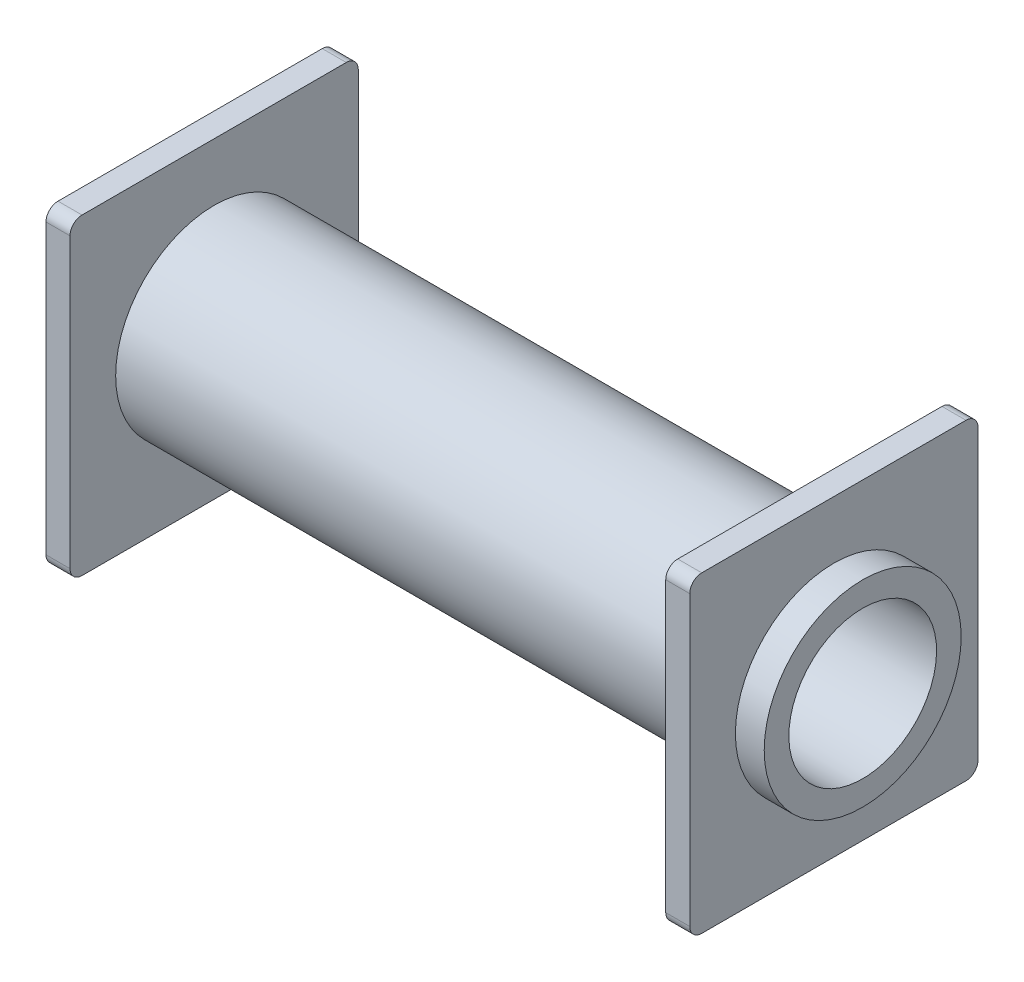
ISO-10303-21;
HEADER;
FILE_DESCRIPTION(('STEP AP214'),'2;1');
FILE_NAME('part.step','',(''),(''),'','','');
FILE_SCHEMA(('AUTOMOTIVE_DESIGN { 1 0 10303 214 1 1 1 1 }'));
ENDSEC;
DATA;
#1=APPLICATION_CONTEXT('core data for automotive mechanical design processes');
#2=APPLICATION_PROTOCOL_DEFINITION('international standard','automotive_design',2000,#1);
#3=PRODUCT_CONTEXT('',#1,'mechanical');
#4=PRODUCT('Part','Part','',(#3));
#5=PRODUCT_RELATED_PRODUCT_CATEGORY('part','',(#4));
#6=PRODUCT_DEFINITION_FORMATION('','',#4);
#7=PRODUCT_DEFINITION_CONTEXT('part definition',#1,'design');
#8=PRODUCT_DEFINITION('design','',#6,#7);
#9=PRODUCT_DEFINITION_SHAPE('','',#8);
#10=(LENGTH_UNIT() NAMED_UNIT(*) SI_UNIT(.MILLI.,.METRE.));
#11=(NAMED_UNIT(*) PLANE_ANGLE_UNIT() SI_UNIT($,.RADIAN.));
#12=(NAMED_UNIT(*) SI_UNIT($,.STERADIAN.) SOLID_ANGLE_UNIT());
#13=UNCERTAINTY_MEASURE_WITH_UNIT(LENGTH_MEASURE(1.E-05),#10,'distance_accuracy_value','');
#14=(GEOMETRIC_REPRESENTATION_CONTEXT(3) GLOBAL_UNCERTAINTY_ASSIGNED_CONTEXT((#13)) GLOBAL_UNIT_ASSIGNED_CONTEXT((#10,
#11,#12)) REPRESENTATION_CONTEXT('',''));
#15=CARTESIAN_POINT('',(0.,0.,0.));
#16=DIRECTION('',(0.,0.,1.));
#17=DIRECTION('',(1.,0.,0.));
#18=AXIS2_PLACEMENT_3D('',#15,#16,#17);
#19=CARTESIAN_POINT('',(-14.,0.,0.));
#20=DIRECTION('',(-1.,0.,0.));
#21=DIRECTION('',(0.,-1.,0.));
#22=AXIS2_PLACEMENT_3D('',#19,#20,#21);
#23=CYLINDRICAL_SURFACE('',#22,4.1);
#24=CARTESIAN_POINT('',(12.8,0.,0.));
#25=DIRECTION('',(1.,0.,0.));
#26=DIRECTION('',(0.,1.,0.));
#27=AXIS2_PLACEMENT_3D('',#24,#25,#26);
#28=CIRCLE('',#27,4.1);
#29=CARTESIAN_POINT('',(12.8,4.1,0.));
#30=VERTEX_POINT('',#29);
#31=EDGE_CURVE('E318',#30,#30,#28,.T.);
#32=ORIENTED_EDGE('',*,*,#31,.T.);
#33=EDGE_LOOP('',(#32));
#34=FACE_BOUND('',#33,.T.);
#35=CARTESIAN_POINT('',(14.,0.,0.));
#36=DIRECTION('',(-1.,0.,0.));
#37=DIRECTION('',(0.,-1.,0.));
#38=AXIS2_PLACEMENT_3D('',#35,#36,#37);
#39=CIRCLE('',#38,4.1);
#40=CARTESIAN_POINT('',(14.,-4.09999999999999,0.));
#41=VERTEX_POINT('',#40);
#42=EDGE_CURVE('E190',#41,#41,#39,.T.);
#43=ORIENTED_EDGE('',*,*,#42,.T.);
#44=EDGE_LOOP('',(#43));
#45=FACE_BOUND('',#44,.T.);
#46=ADVANCED_FACE('F38',(#34,#45),#23,.T.);
#47=CARTESIAN_POINT('',(14.,0.,0.));
#48=DIRECTION('',(-1.,0.,0.));
#49=DIRECTION('',(0.,-1.,0.));
#50=AXIS2_PLACEMENT_3D('',#47,#48,#49);
#51=PLANE('',#50);
#52=CARTESIAN_POINT('',(14.,0.,0.));
#53=DIRECTION('',(1.,0.,0.));
#54=DIRECTION('',(0.,1.,0.));
#55=AXIS2_PLACEMENT_3D('',#52,#53,#54);
#56=CIRCLE('',#55,3.075);
#57=CARTESIAN_POINT('',(14.,3.07500000000001,0.));
#58=VERTEX_POINT('',#57);
#59=EDGE_CURVE('E442',#58,#58,#56,.T.);
#60=ORIENTED_EDGE('',*,*,#59,.F.);
#61=EDGE_LOOP('',(#60));
#62=FACE_BOUND('',#61,.T.);
#63=ORIENTED_EDGE('',*,*,#42,.F.);
#64=EDGE_LOOP('',(#63));
#65=FACE_BOUND('',#64,.T.);
#66=ADVANCED_FACE('F383',(#62,#65),#51,.F.);
#67=CARTESIAN_POINT('',(12.8,6.5,6.));
#68=DIRECTION('',(0.,0.,-1.));
#69=DIRECTION('',(0.,1.,0.));
#70=AXIS2_PLACEMENT_3D('',#67,#68,#69);
#71=PLANE('',#70);
#72=DIRECTION('',(0.,-1.,0.));
#73=VECTOR('',#72,1.);
#74=CARTESIAN_POINT('',(11.8,6.5,6.));
#75=LINE('',#74,#73);
#76=CARTESIAN_POINT('',(11.8,6.,6.));
#77=VERTEX_POINT('',#76);
#78=CARTESIAN_POINT('',(11.8,-5.99999999999999,6.));
#79=VERTEX_POINT('',#78);
#80=EDGE_CURVE('E287',#77,#79,#75,.T.);
#81=ORIENTED_EDGE('',*,*,#80,.T.);
#82=DIRECTION('',(-1.,0.,0.));
#83=VECTOR('',#82,1.);
#84=CARTESIAN_POINT('',(12.8,-6.,6.));
#85=LINE('',#84,#83);
#86=CARTESIAN_POINT('',(12.8,-5.99999999999999,6.));
#87=VERTEX_POINT('',#86);
#88=EDGE_CURVE('E275',#79,#87,#85,.F.);
#89=ORIENTED_EDGE('',*,*,#88,.T.);
#90=DIRECTION('',(0.,-1.,0.));
#91=VECTOR('',#90,1.);
#92=CARTESIAN_POINT('',(12.8,6.5,6.));
#93=LINE('',#92,#91);
#94=CARTESIAN_POINT('',(12.8,6.,6.));
#95=VERTEX_POINT('',#94);
#96=EDGE_CURVE('E303',#95,#87,#93,.T.);
#97=ORIENTED_EDGE('',*,*,#96,.F.);
#98=DIRECTION('',(-1.,0.,0.));
#99=VECTOR('',#98,1.);
#100=CARTESIAN_POINT('',(12.8,6.,6.));
#101=LINE('',#100,#99);
#102=EDGE_CURVE('E271',#95,#77,#101,.T.);
#103=ORIENTED_EDGE('',*,*,#102,.T.);
#104=EDGE_LOOP('',(#81,#89,#97,#103));
#105=FACE_BOUND('',#104,.T.);
#106=ADVANCED_FACE('F371',(#105),#71,.F.);
#107=CARTESIAN_POINT('',(12.8,-6.5,6.));
#108=DIRECTION('',(0.,1.,0.));
#109=DIRECTION('',(-1.,0.,0.));
#110=AXIS2_PLACEMENT_3D('',#107,#108,#109);
#111=PLANE('',#110);
#112=DIRECTION('',(0.,0.,-1.));
#113=VECTOR('',#112,1.);
#114=CARTESIAN_POINT('',(11.8,-6.5,6.));
#115=LINE('',#114,#113);
#116=CARTESIAN_POINT('',(11.8,-6.5,5.5));
#117=VERTEX_POINT('',#116);
#118=CARTESIAN_POINT('',(11.8,-6.5,-5.5));
#119=VERTEX_POINT('',#118);
#120=EDGE_CURVE('E322',#117,#119,#115,.T.);
#121=ORIENTED_EDGE('',*,*,#120,.T.);
#122=DIRECTION('',(-1.,0.,0.));
#123=VECTOR('',#122,1.);
#124=CARTESIAN_POINT('',(12.8,-6.5,-5.5));
#125=LINE('',#124,#123);
#126=CARTESIAN_POINT('',(12.8,-6.5,-5.5));
#127=VERTEX_POINT('',#126);
#128=EDGE_CURVE('E257',#119,#127,#125,.F.);
#129=ORIENTED_EDGE('',*,*,#128,.T.);
#130=DIRECTION('',(0.,0.,-1.));
#131=VECTOR('',#130,1.);
#132=CARTESIAN_POINT('',(12.8,-6.5,6.));
#133=LINE('',#132,#131);
#134=CARTESIAN_POINT('',(12.8,-6.5,5.5));
#135=VERTEX_POINT('',#134);
#136=EDGE_CURVE('E307',#135,#127,#133,.T.);
#137=ORIENTED_EDGE('',*,*,#136,.F.);
#138=DIRECTION('',(-1.,0.,0.));
#139=VECTOR('',#138,1.);
#140=CARTESIAN_POINT('',(12.8,-6.5,5.5));
#141=LINE('',#140,#139);
#142=EDGE_CURVE('E253',#135,#117,#141,.T.);
#143=ORIENTED_EDGE('',*,*,#142,.T.);
#144=EDGE_LOOP('',(#121,#129,#137,#143));
#145=FACE_BOUND('',#144,.T.);
#146=ADVANCED_FACE('F375',(#145),#111,.F.);
#147=CARTESIAN_POINT('',(12.8,6.5,-6.));
#148=DIRECTION('',(0.,0.,1.));
#149=DIRECTION('',(0.,-1.,0.));
#150=AXIS2_PLACEMENT_3D('',#147,#148,#149);
#151=PLANE('',#150);
#152=DIRECTION('',(0.,1.,0.));
#153=VECTOR('',#152,1.);
#154=CARTESIAN_POINT('',(12.8,6.5,-6.));
#155=LINE('',#154,#153);
#156=CARTESIAN_POINT('',(12.8,-5.99999999999999,-6.));
#157=VERTEX_POINT('',#156);
#158=CARTESIAN_POINT('',(12.8,6.,-6.));
#159=VERTEX_POINT('',#158);
#160=EDGE_CURVE('E312',#157,#159,#155,.T.);
#161=ORIENTED_EDGE('',*,*,#160,.F.);
#162=DIRECTION('',(-1.,0.,0.));
#163=VECTOR('',#162,1.);
#164=CARTESIAN_POINT('',(12.8,-6.,-6.));
#165=LINE('',#164,#163);
#166=CARTESIAN_POINT('',(11.8,-5.99999999999999,-6.));
#167=VERTEX_POINT('',#166);
#168=EDGE_CURVE('E237',#157,#167,#165,.T.);
#169=ORIENTED_EDGE('',*,*,#168,.T.);
#170=DIRECTION('',(0.,1.,0.));
#171=VECTOR('',#170,1.);
#172=CARTESIAN_POINT('',(11.8,6.5,-6.));
#173=LINE('',#172,#171);
#174=CARTESIAN_POINT('',(11.8,6.,-6.));
#175=VERTEX_POINT('',#174);
#176=EDGE_CURVE('E326',#167,#175,#173,.T.);
#177=ORIENTED_EDGE('',*,*,#176,.T.);
#178=DIRECTION('',(-1.,0.,0.));
#179=VECTOR('',#178,1.);
#180=CARTESIAN_POINT('',(12.8,6.,-6.));
#181=LINE('',#180,#179);
#182=EDGE_CURVE('E234',#175,#159,#181,.F.);
#183=ORIENTED_EDGE('',*,*,#182,.T.);
#184=EDGE_LOOP('',(#161,#169,#177,#183));
#185=FACE_BOUND('',#184,.T.);
#186=ADVANCED_FACE('F357',(#185),#151,.F.);
#187=CARTESIAN_POINT('',(12.8,6.5,6.));
#188=DIRECTION('',(0.,-1.,0.));
#189=DIRECTION('',(1.,0.,0.));
#190=AXIS2_PLACEMENT_3D('',#187,#188,#189);
#191=PLANE('',#190);
#192=DIRECTION('',(0.,0.,1.));
#193=VECTOR('',#192,1.);
#194=CARTESIAN_POINT('',(12.8,6.5,6.));
#195=LINE('',#194,#193);
#196=CARTESIAN_POINT('',(12.8,6.5,-5.5));
#197=VERTEX_POINT('',#196);
#198=CARTESIAN_POINT('',(12.8,6.5,5.5));
#199=VERTEX_POINT('',#198);
#200=EDGE_CURVE('E315',#197,#199,#195,.T.);
#201=ORIENTED_EDGE('',*,*,#200,.F.);
#202=DIRECTION('',(-1.,0.,0.));
#203=VECTOR('',#202,1.);
#204=CARTESIAN_POINT('',(12.8,6.5,-5.5));
#205=LINE('',#204,#203);
#206=CARTESIAN_POINT('',(11.8,6.5,-5.5));
#207=VERTEX_POINT('',#206);
#208=EDGE_CURVE('E11',#197,#207,#205,.T.);
#209=ORIENTED_EDGE('',*,*,#208,.T.);
#210=DIRECTION('',(0.,0.,1.));
#211=VECTOR('',#210,1.);
#212=CARTESIAN_POINT('',(11.8,6.5,6.));
#213=LINE('',#212,#211);
#214=CARTESIAN_POINT('',(11.8,6.5,5.5));
#215=VERTEX_POINT('',#214);
#216=EDGE_CURVE('E308',#207,#215,#213,.T.);
#217=ORIENTED_EDGE('',*,*,#216,.T.);
#218=DIRECTION('',(-1.,0.,0.));
#219=VECTOR('',#218,1.);
#220=CARTESIAN_POINT('',(12.8,6.5,5.5));
#221=LINE('',#220,#219);
#222=EDGE_CURVE('E47',#215,#199,#221,.F.);
#223=ORIENTED_EDGE('',*,*,#222,.T.);
#224=EDGE_LOOP('',(#201,#209,#217,#223));
#225=FACE_BOUND('',#224,.T.);
#226=ADVANCED_FACE('F343',(#225),#191,.F.);
#227=CARTESIAN_POINT('',(12.8,0.,0.));
#228=DIRECTION('',(1.,0.,0.));
#229=DIRECTION('',(0.,1.,0.));
#230=AXIS2_PLACEMENT_3D('',#227,#228,#229);
#231=PLANE('',#230);
#232=ORIENTED_EDGE('',*,*,#31,.F.);
#233=EDGE_LOOP('',(#232));
#234=FACE_BOUND('',#233,.T.);
#235=ORIENTED_EDGE('',*,*,#136,.T.);
#236=CARTESIAN_POINT('',(12.8,-6.,-5.5));
#237=DIRECTION('',(1.,0.,0.));
#238=DIRECTION('',(0.,1.,0.));
#239=AXIS2_PLACEMENT_3D('',#236,#237,#238);
#240=CIRCLE('',#239,0.5);
#241=EDGE_CURVE('E268',#127,#157,#240,.T.);
#242=ORIENTED_EDGE('',*,*,#241,.T.);
#243=ORIENTED_EDGE('',*,*,#160,.T.);
#244=CARTESIAN_POINT('',(12.8,6.,-5.5));
#245=DIRECTION('',(1.,0.,0.));
#246=DIRECTION('',(0.,1.,0.));
#247=AXIS2_PLACEMENT_3D('',#244,#245,#246);
#248=CIRCLE('',#247,0.5);
#249=EDGE_CURVE('E60',#159,#197,#248,.T.);
#250=ORIENTED_EDGE('',*,*,#249,.T.);
#251=ORIENTED_EDGE('',*,*,#200,.T.);
#252=CARTESIAN_POINT('',(12.8,6.,5.5));
#253=DIRECTION('',(1.,0.,0.));
#254=DIRECTION('',(0.,1.,0.));
#255=AXIS2_PLACEMENT_3D('',#252,#253,#254);
#256=CIRCLE('',#255,0.5);
#257=EDGE_CURVE('E260',#199,#95,#256,.T.);
#258=ORIENTED_EDGE('',*,*,#257,.T.);
#259=ORIENTED_EDGE('',*,*,#96,.T.);
#260=CARTESIAN_POINT('',(12.8,-6.,5.5));
#261=DIRECTION('',(1.,0.,0.));
#262=DIRECTION('',(0.,1.,0.));
#263=AXIS2_PLACEMENT_3D('',#260,#261,#262);
#264=CIRCLE('',#263,0.5);
#265=EDGE_CURVE('E265',#87,#135,#264,.T.);
#266=ORIENTED_EDGE('',*,*,#265,.T.);
#267=EDGE_LOOP('',(#235,#242,#243,#250,#251,#258,#259,#266));
#268=FACE_BOUND('',#267,.T.);
#269=ADVANCED_FACE('F340',(#234,#268),#231,.T.);
#270=CARTESIAN_POINT('',(11.8,0.,0.));
#271=DIRECTION('',(1.,0.,0.));
#272=DIRECTION('',(0.,1.,0.));
#273=AXIS2_PLACEMENT_3D('',#270,#271,#272);
#274=PLANE('',#273);
#275=CARTESIAN_POINT('',(11.8,0.,0.));
#276=DIRECTION('',(1.,0.,0.));
#277=DIRECTION('',(0.,1.,0.));
#278=AXIS2_PLACEMENT_3D('',#275,#276,#277);
#279=CIRCLE('',#278,4.1);
#280=CARTESIAN_POINT('',(11.8,4.1,0.));
#281=VERTEX_POINT('',#280);
#282=EDGE_CURVE('E183',#281,#281,#279,.T.);
#283=ORIENTED_EDGE('',*,*,#282,.T.);
#284=EDGE_LOOP('',(#283));
#285=FACE_BOUND('',#284,.T.);
#286=ORIENTED_EDGE('',*,*,#176,.F.);
#287=CARTESIAN_POINT('',(11.8,-6.,-5.5));
#288=DIRECTION('',(1.,0.,0.));
#289=DIRECTION('',(0.,1.,0.));
#290=AXIS2_PLACEMENT_3D('',#287,#288,#289);
#291=CIRCLE('',#290,0.5);
#292=EDGE_CURVE('E250',#167,#119,#291,.F.);
#293=ORIENTED_EDGE('',*,*,#292,.T.);
#294=ORIENTED_EDGE('',*,*,#120,.F.);
#295=CARTESIAN_POINT('',(11.8,-6.,5.5));
#296=DIRECTION('',(1.,0.,0.));
#297=DIRECTION('',(0.,1.,0.));
#298=AXIS2_PLACEMENT_3D('',#295,#296,#297);
#299=CIRCLE('',#298,0.5);
#300=EDGE_CURVE('E247',#117,#79,#299,.F.);
#301=ORIENTED_EDGE('',*,*,#300,.T.);
#302=ORIENTED_EDGE('',*,*,#80,.F.);
#303=CARTESIAN_POINT('',(11.8,6.,5.5));
#304=DIRECTION('',(1.,0.,0.));
#305=DIRECTION('',(0.,1.,0.));
#306=AXIS2_PLACEMENT_3D('',#303,#304,#305);
#307=CIRCLE('',#306,0.5);
#308=EDGE_CURVE('E241',#77,#215,#307,.F.);
#309=ORIENTED_EDGE('',*,*,#308,.T.);
#310=ORIENTED_EDGE('',*,*,#216,.F.);
#311=CARTESIAN_POINT('',(11.8,6.,-5.5));
#312=DIRECTION('',(1.,0.,0.));
#313=DIRECTION('',(0.,1.,0.));
#314=AXIS2_PLACEMENT_3D('',#311,#312,#313);
#315=CIRCLE('',#314,0.5);
#316=EDGE_CURVE('E244',#207,#175,#315,.F.);
#317=ORIENTED_EDGE('',*,*,#316,.T.);
#318=EDGE_LOOP('',(#286,#293,#294,#301,#302,#309,#310,#317));
#319=FACE_BOUND('',#318,.T.);
#320=ADVANCED_FACE('F342',(#285,#319),#274,.F.);
#321=CARTESIAN_POINT('',(-13.,0.,0.));
#322=DIRECTION('',(1.,0.,0.));
#323=DIRECTION('',(0.,1.,0.));
#324=AXIS2_PLACEMENT_3D('',#321,#322,#323);
#325=CIRCLE('',#324,4.1);
#326=CARTESIAN_POINT('',(-13.,4.1,0.));
#327=VERTEX_POINT('',#326);
#328=EDGE_CURVE('E193',#327,#327,#325,.T.);
#329=ORIENTED_EDGE('',*,*,#328,.T.);
#330=EDGE_LOOP('',(#329));
#331=FACE_BOUND('',#330,.T.);
#332=ORIENTED_EDGE('',*,*,#282,.F.);
#333=EDGE_LOOP('',(#332));
#334=FACE_BOUND('',#333,.T.);
#335=ADVANCED_FACE('F387',(#331,#334),#23,.T.);
#336=CARTESIAN_POINT('',(-13.,-6.5,-6.));
#337=DIRECTION('',(0.,0.,-1.));
#338=DIRECTION('',(0.,1.,0.));
#339=AXIS2_PLACEMENT_3D('',#336,#337,#338);
#340=PLANE('',#339);
#341=DIRECTION('',(0.,-1.,0.));
#342=VECTOR('',#341,1.);
#343=CARTESIAN_POINT('',(-13.,-6.5,-6.));
#344=LINE('',#343,#342);
#345=CARTESIAN_POINT('',(-13.,5.99999999999999,-6.));
#346=VERTEX_POINT('',#345);
#347=CARTESIAN_POINT('',(-13.,-6.,-6.));
#348=VERTEX_POINT('',#347);
#349=EDGE_CURVE('E302',#346,#348,#344,.T.);
#350=ORIENTED_EDGE('',*,*,#349,.T.);
#351=DIRECTION('',(-1.,0.,0.));
#352=VECTOR('',#351,1.);
#353=CARTESIAN_POINT('',(-13.,-6.,-6.));
#354=LINE('',#353,#352);
#355=CARTESIAN_POINT('',(-14.,-6.,-6.));
#356=VERTEX_POINT('',#355);
#357=EDGE_CURVE('E174',#348,#356,#354,.T.);
#358=ORIENTED_EDGE('',*,*,#357,.T.);
#359=DIRECTION('',(0.,-1.,0.));
#360=VECTOR('',#359,1.);
#361=CARTESIAN_POINT('',(-14.,-6.5,-6.));
#362=LINE('',#361,#360);
#363=CARTESIAN_POINT('',(-14.,5.99999999999999,-6.));
#364=VERTEX_POINT('',#363);
#365=EDGE_CURVE('E156',#364,#356,#362,.T.);
#366=ORIENTED_EDGE('',*,*,#365,.F.);
#367=DIRECTION('',(-1.,0.,0.));
#368=VECTOR('',#367,1.);
#369=CARTESIAN_POINT('',(-13.,6.,-6.));
#370=LINE('',#369,#368);
#371=EDGE_CURVE('E171',#364,#346,#370,.F.);
#372=ORIENTED_EDGE('',*,*,#371,.T.);
#373=EDGE_LOOP('',(#350,#358,#366,#372));
#374=FACE_BOUND('',#373,.T.);
#375=ADVANCED_FACE('F170',(#374),#340,.T.);
#376=CARTESIAN_POINT('',(-13.,6.5,-6.));
#377=DIRECTION('',(0.,1.,0.));
#378=DIRECTION('',(-1.,0.,0.));
#379=AXIS2_PLACEMENT_3D('',#376,#377,#378);
#380=PLANE('',#379);
#381=DIRECTION('',(0.,0.,-1.));
#382=VECTOR('',#381,1.);
#383=CARTESIAN_POINT('',(-13.,6.5,-6.));
#384=LINE('',#383,#382);
#385=CARTESIAN_POINT('',(-13.,6.5,5.5));
#386=VERTEX_POINT('',#385);
#387=CARTESIAN_POINT('',(-13.,6.5,-5.5));
#388=VERTEX_POINT('',#387);
#389=EDGE_CURVE('E279',#386,#388,#384,.T.);
#390=ORIENTED_EDGE('',*,*,#389,.T.);
#391=DIRECTION('',(-1.,0.,0.));
#392=VECTOR('',#391,1.);
#393=CARTESIAN_POINT('',(-13.,6.5,-5.5));
#394=LINE('',#393,#392);
#395=CARTESIAN_POINT('',(-14.,6.5,-5.5));
#396=VERTEX_POINT('',#395);
#397=EDGE_CURVE('E231',#388,#396,#394,.T.);
#398=ORIENTED_EDGE('',*,*,#397,.T.);
#399=DIRECTION('',(0.,0.,-1.));
#400=VECTOR('',#399,1.);
#401=CARTESIAN_POINT('',(-14.,6.5,-6.));
#402=LINE('',#401,#400);
#403=CARTESIAN_POINT('',(-14.,6.5,5.5));
#404=VERTEX_POINT('',#403);
#405=EDGE_CURVE('E158',#404,#396,#402,.T.);
#406=ORIENTED_EDGE('',*,*,#405,.F.);
#407=DIRECTION('',(-1.,0.,0.));
#408=VECTOR('',#407,1.);
#409=CARTESIAN_POINT('',(-13.,6.5,5.5));
#410=LINE('',#409,#408);
#411=EDGE_CURVE('E228',#404,#386,#410,.F.);
#412=ORIENTED_EDGE('',*,*,#411,.T.);
#413=EDGE_LOOP('',(#390,#398,#406,#412));
#414=FACE_BOUND('',#413,.T.);
#415=ADVANCED_FACE('F400',(#414),#380,.T.);
#416=CARTESIAN_POINT('',(-13.,6.5,6.));
#417=DIRECTION('',(0.,0.,1.));
#418=DIRECTION('',(0.,-1.,0.));
#419=AXIS2_PLACEMENT_3D('',#416,#417,#418);
#420=PLANE('',#419);
#421=DIRECTION('',(0.,1.,0.));
#422=VECTOR('',#421,1.);
#423=CARTESIAN_POINT('',(-14.,6.5,6.));
#424=LINE('',#423,#422);
#425=CARTESIAN_POINT('',(-14.,-6.,6.));
#426=VERTEX_POINT('',#425);
#427=CARTESIAN_POINT('',(-14.,6.,6.));
#428=VERTEX_POINT('',#427);
#429=EDGE_CURVE('E296',#426,#428,#424,.T.);
#430=ORIENTED_EDGE('',*,*,#429,.F.);
#431=DIRECTION('',(-1.,0.,0.));
#432=VECTOR('',#431,1.);
#433=CARTESIAN_POINT('',(-13.,-6.,6.));
#434=LINE('',#433,#432);
#435=CARTESIAN_POINT('',(-13.,-6.,6.));
#436=VERTEX_POINT('',#435);
#437=EDGE_CURVE('E225',#426,#436,#434,.F.);
#438=ORIENTED_EDGE('',*,*,#437,.T.);
#439=DIRECTION('',(0.,1.,0.));
#440=VECTOR('',#439,1.);
#441=CARTESIAN_POINT('',(-13.,6.5,6.));
#442=LINE('',#441,#440);
#443=CARTESIAN_POINT('',(-13.,6.,6.));
#444=VERTEX_POINT('',#443);
#445=EDGE_CURVE('E281',#436,#444,#442,.T.);
#446=ORIENTED_EDGE('',*,*,#445,.T.);
#447=DIRECTION('',(-1.,0.,0.));
#448=VECTOR('',#447,1.);
#449=CARTESIAN_POINT('',(-13.,6.,6.));
#450=LINE('',#449,#448);
#451=EDGE_CURVE('E221',#444,#428,#450,.T.);
#452=ORIENTED_EDGE('',*,*,#451,.T.);
#453=EDGE_LOOP('',(#430,#438,#446,#452));
#454=FACE_BOUND('',#453,.T.);
#455=ADVANCED_FACE('F430',(#454),#420,.T.);
#456=CARTESIAN_POINT('',(-13.,-6.5,6.));
#457=DIRECTION('',(0.,-1.,0.));
#458=DIRECTION('',(1.,0.,0.));
#459=AXIS2_PLACEMENT_3D('',#456,#457,#458);
#460=PLANE('',#459);
#461=DIRECTION('',(0.,0.,1.));
#462=VECTOR('',#461,1.);
#463=CARTESIAN_POINT('',(-14.,-6.5,6.));
#464=LINE('',#463,#462);
#465=CARTESIAN_POINT('',(-14.,-6.5,-5.5));
#466=VERTEX_POINT('',#465);
#467=CARTESIAN_POINT('',(-14.,-6.5,5.5));
#468=VERTEX_POINT('',#467);
#469=EDGE_CURVE('E176',#466,#468,#464,.T.);
#470=ORIENTED_EDGE('',*,*,#469,.F.);
#471=DIRECTION('',(-1.,0.,0.));
#472=VECTOR('',#471,1.);
#473=CARTESIAN_POINT('',(-13.,-6.5,-5.5));
#474=LINE('',#473,#472);
#475=CARTESIAN_POINT('',(-13.,-6.5,-5.5));
#476=VERTEX_POINT('',#475);
#477=EDGE_CURVE('E207',#466,#476,#474,.F.);
#478=ORIENTED_EDGE('',*,*,#477,.T.);
#479=DIRECTION('',(0.,0.,1.));
#480=VECTOR('',#479,1.);
#481=CARTESIAN_POINT('',(-13.,-6.5,6.));
#482=LINE('',#481,#480);
#483=CARTESIAN_POINT('',(-13.,-6.5,5.5));
#484=VERTEX_POINT('',#483);
#485=EDGE_CURVE('E289',#476,#484,#482,.T.);
#486=ORIENTED_EDGE('',*,*,#485,.T.);
#487=DIRECTION('',(-1.,0.,0.));
#488=VECTOR('',#487,1.);
#489=CARTESIAN_POINT('',(-13.,-6.5,5.5));
#490=LINE('',#489,#488);
#491=EDGE_CURVE('E203',#484,#468,#490,.T.);
#492=ORIENTED_EDGE('',*,*,#491,.T.);
#493=EDGE_LOOP('',(#470,#478,#486,#492));
#494=FACE_BOUND('',#493,.T.);
#495=ADVANCED_FACE('F411',(#494),#460,.T.);
#496=CARTESIAN_POINT('',(-13.,0.,0.));
#497=DIRECTION('',(1.,0.,0.));
#498=DIRECTION('',(0.,1.,0.));
#499=AXIS2_PLACEMENT_3D('',#496,#497,#498);
#500=PLANE('',#499);
#501=ORIENTED_EDGE('',*,*,#328,.F.);
#502=EDGE_LOOP('',(#501));
#503=FACE_BOUND('',#502,.T.);
#504=ORIENTED_EDGE('',*,*,#485,.F.);
#505=CARTESIAN_POINT('',(-13.,-6.,-5.5));
#506=DIRECTION('',(1.,0.,0.));
#507=DIRECTION('',(0.,1.,0.));
#508=AXIS2_PLACEMENT_3D('',#505,#506,#507);
#509=CIRCLE('',#508,0.5);
#510=EDGE_CURVE('E218',#476,#348,#509,.T.);
#511=ORIENTED_EDGE('',*,*,#510,.T.);
#512=ORIENTED_EDGE('',*,*,#349,.F.);
#513=CARTESIAN_POINT('',(-13.,6.,-5.5));
#514=DIRECTION('',(1.,0.,0.));
#515=DIRECTION('',(0.,1.,0.));
#516=AXIS2_PLACEMENT_3D('',#513,#514,#515);
#517=CIRCLE('',#516,0.5);
#518=EDGE_CURVE('E181',#346,#388,#517,.T.);
#519=ORIENTED_EDGE('',*,*,#518,.T.);
#520=ORIENTED_EDGE('',*,*,#389,.F.);
#521=CARTESIAN_POINT('',(-13.,6.,5.5));
#522=DIRECTION('',(1.,0.,0.));
#523=DIRECTION('',(0.,1.,0.));
#524=AXIS2_PLACEMENT_3D('',#521,#522,#523);
#525=CIRCLE('',#524,0.5);
#526=EDGE_CURVE('E210',#386,#444,#525,.T.);
#527=ORIENTED_EDGE('',*,*,#526,.T.);
#528=ORIENTED_EDGE('',*,*,#445,.F.);
#529=CARTESIAN_POINT('',(-13.,-6.,5.5));
#530=DIRECTION('',(1.,0.,0.));
#531=DIRECTION('',(0.,1.,0.));
#532=AXIS2_PLACEMENT_3D('',#529,#530,#531);
#533=CIRCLE('',#532,0.5);
#534=EDGE_CURVE('E215',#436,#484,#533,.T.);
#535=ORIENTED_EDGE('',*,*,#534,.T.);
#536=EDGE_LOOP('',(#504,#511,#512,#519,#520,#527,#528,#535));
#537=FACE_BOUND('',#536,.T.);
#538=ADVANCED_FACE('F408',(#503,#537),#500,.T.);
#539=CARTESIAN_POINT('',(-14.,0.,0.));
#540=DIRECTION('',(1.,0.,0.));
#541=DIRECTION('',(0.,1.,0.));
#542=AXIS2_PLACEMENT_3D('',#539,#540,#541);
#543=PLANE('',#542);
#544=CARTESIAN_POINT('',(-14.,0.,0.));
#545=DIRECTION('',(1.,0.,0.));
#546=DIRECTION('',(0.,1.,0.));
#547=AXIS2_PLACEMENT_3D('',#544,#545,#546);
#548=CIRCLE('',#547,3.075);
#549=CARTESIAN_POINT('',(-14.,3.075,0.));
#550=VERTEX_POINT('',#549);
#551=EDGE_CURVE('E177',#550,#550,#548,.F.);
#552=ORIENTED_EDGE('',*,*,#551,.F.);
#553=EDGE_LOOP('',(#552));
#554=FACE_BOUND('',#553,.T.);
#555=ORIENTED_EDGE('',*,*,#365,.T.);
#556=CARTESIAN_POINT('',(-14.,-6.,-5.5));
#557=DIRECTION('',(1.,0.,0.));
#558=DIRECTION('',(0.,1.,0.));
#559=AXIS2_PLACEMENT_3D('',#556,#557,#558);
#560=CIRCLE('',#559,0.5);
#561=EDGE_CURVE('E200',#356,#466,#560,.F.);
#562=ORIENTED_EDGE('',*,*,#561,.T.);
#563=ORIENTED_EDGE('',*,*,#469,.T.);
#564=CARTESIAN_POINT('',(-14.,-6.,5.5));
#565=DIRECTION('',(1.,0.,0.));
#566=DIRECTION('',(0.,1.,0.));
#567=AXIS2_PLACEMENT_3D('',#564,#565,#566);
#568=CIRCLE('',#567,0.5);
#569=EDGE_CURVE('E164',#468,#426,#568,.F.);
#570=ORIENTED_EDGE('',*,*,#569,.T.);
#571=ORIENTED_EDGE('',*,*,#429,.T.);
#572=CARTESIAN_POINT('',(-14.,6.,5.5));
#573=DIRECTION('',(1.,0.,0.));
#574=DIRECTION('',(0.,1.,0.));
#575=AXIS2_PLACEMENT_3D('',#572,#573,#574);
#576=CIRCLE('',#575,0.5);
#577=EDGE_CURVE('E165',#428,#404,#576,.F.);
#578=ORIENTED_EDGE('',*,*,#577,.T.);
#579=ORIENTED_EDGE('',*,*,#405,.T.);
#580=CARTESIAN_POINT('',(-14.,6.,-5.5));
#581=DIRECTION('',(1.,0.,0.));
#582=DIRECTION('',(0.,1.,0.));
#583=AXIS2_PLACEMENT_3D('',#580,#581,#582);
#584=CIRCLE('',#583,0.5);
#585=EDGE_CURVE('E153',#396,#364,#584,.F.);
#586=ORIENTED_EDGE('',*,*,#585,.T.);
#587=EDGE_LOOP('',(#555,#562,#563,#570,#571,#578,#579,#586));
#588=FACE_BOUND('',#587,.T.);
#589=ADVANCED_FACE('F155',(#554,#588),#543,.F.);
#590=CARTESIAN_POINT('',(-13.,-6.,-5.5));
#591=DIRECTION('',(-1.,0.,0.));
#592=DIRECTION('',(0.,-1.,0.));
#593=AXIS2_PLACEMENT_3D('',#590,#591,#592);
#594=CYLINDRICAL_SURFACE('',#593,0.5);
#595=ORIENTED_EDGE('',*,*,#510,.F.);
#596=ORIENTED_EDGE('',*,*,#477,.F.);
#597=ORIENTED_EDGE('',*,*,#561,.F.);
#598=ORIENTED_EDGE('',*,*,#357,.F.);
#599=EDGE_LOOP('',(#595,#596,#597,#598));
#600=FACE_BOUND('',#599,.T.);
#601=ADVANCED_FACE('F423',(#600),#594,.T.);
#602=CARTESIAN_POINT('',(-13.,-6.,5.5));
#603=DIRECTION('',(-1.,0.,0.));
#604=DIRECTION('',(0.,-1.,0.));
#605=AXIS2_PLACEMENT_3D('',#602,#603,#604);
#606=CYLINDRICAL_SURFACE('',#605,0.5);
#607=ORIENTED_EDGE('',*,*,#534,.F.);
#608=ORIENTED_EDGE('',*,*,#437,.F.);
#609=ORIENTED_EDGE('',*,*,#569,.F.);
#610=ORIENTED_EDGE('',*,*,#491,.F.);
#611=EDGE_LOOP('',(#607,#608,#609,#610));
#612=FACE_BOUND('',#611,.T.);
#613=ADVANCED_FACE('F426',(#612),#606,.T.);
#614=CARTESIAN_POINT('',(-13.,6.,-5.5));
#615=DIRECTION('',(-1.,0.,0.));
#616=DIRECTION('',(0.,-1.,0.));
#617=AXIS2_PLACEMENT_3D('',#614,#615,#616);
#618=CYLINDRICAL_SURFACE('',#617,0.5);
#619=ORIENTED_EDGE('',*,*,#518,.F.);
#620=ORIENTED_EDGE('',*,*,#371,.F.);
#621=ORIENTED_EDGE('',*,*,#585,.F.);
#622=ORIENTED_EDGE('',*,*,#397,.F.);
#623=EDGE_LOOP('',(#619,#620,#621,#622));
#624=FACE_BOUND('',#623,.T.);
#625=ADVANCED_FACE('F180',(#624),#618,.T.);
#626=CARTESIAN_POINT('',(-13.,6.,5.5));
#627=DIRECTION('',(-1.,0.,0.));
#628=DIRECTION('',(0.,-1.,0.));
#629=AXIS2_PLACEMENT_3D('',#626,#627,#628);
#630=CYLINDRICAL_SURFACE('',#629,0.5);
#631=ORIENTED_EDGE('',*,*,#526,.F.);
#632=ORIENTED_EDGE('',*,*,#411,.F.);
#633=ORIENTED_EDGE('',*,*,#577,.F.);
#634=ORIENTED_EDGE('',*,*,#451,.F.);
#635=EDGE_LOOP('',(#631,#632,#633,#634));
#636=FACE_BOUND('',#635,.T.);
#637=ADVANCED_FACE('F434',(#636),#630,.T.);
#638=CARTESIAN_POINT('',(12.8,-6.,-5.5));
#639=DIRECTION('',(-1.,0.,0.));
#640=DIRECTION('',(0.,-1.,0.));
#641=AXIS2_PLACEMENT_3D('',#638,#639,#640);
#642=CYLINDRICAL_SURFACE('',#641,0.5);
#643=ORIENTED_EDGE('',*,*,#241,.F.);
#644=ORIENTED_EDGE('',*,*,#128,.F.);
#645=ORIENTED_EDGE('',*,*,#292,.F.);
#646=ORIENTED_EDGE('',*,*,#168,.F.);
#647=EDGE_LOOP('',(#643,#644,#645,#646));
#648=FACE_BOUND('',#647,.T.);
#649=ADVANCED_FACE('F354',(#648),#642,.T.);
#650=CARTESIAN_POINT('',(12.8,-6.,5.5));
#651=DIRECTION('',(-1.,0.,0.));
#652=DIRECTION('',(0.,-1.,0.));
#653=AXIS2_PLACEMENT_3D('',#650,#651,#652);
#654=CYLINDRICAL_SURFACE('',#653,0.5);
#655=ORIENTED_EDGE('',*,*,#265,.F.);
#656=ORIENTED_EDGE('',*,*,#88,.F.);
#657=ORIENTED_EDGE('',*,*,#300,.F.);
#658=ORIENTED_EDGE('',*,*,#142,.F.);
#659=EDGE_LOOP('',(#655,#656,#657,#658));
#660=FACE_BOUND('',#659,.T.);
#661=ADVANCED_FACE('F374',(#660),#654,.T.);
#662=CARTESIAN_POINT('',(12.8,6.,-5.5));
#663=DIRECTION('',(-1.,0.,0.));
#664=DIRECTION('',(0.,-1.,0.));
#665=AXIS2_PLACEMENT_3D('',#662,#663,#664);
#666=CYLINDRICAL_SURFACE('',#665,0.5);
#667=ORIENTED_EDGE('',*,*,#249,.F.);
#668=ORIENTED_EDGE('',*,*,#182,.F.);
#669=ORIENTED_EDGE('',*,*,#316,.F.);
#670=ORIENTED_EDGE('',*,*,#208,.F.);
#671=EDGE_LOOP('',(#667,#668,#669,#670));
#672=FACE_BOUND('',#671,.T.);
#673=ADVANCED_FACE('F364',(#672),#666,.T.);
#674=CARTESIAN_POINT('',(12.8,6.,5.5));
#675=DIRECTION('',(-1.,0.,0.));
#676=DIRECTION('',(0.,-1.,0.));
#677=AXIS2_PLACEMENT_3D('',#674,#675,#676);
#678=CYLINDRICAL_SURFACE('',#677,0.5);
#679=ORIENTED_EDGE('',*,*,#257,.F.);
#680=ORIENTED_EDGE('',*,*,#222,.F.);
#681=ORIENTED_EDGE('',*,*,#308,.F.);
#682=ORIENTED_EDGE('',*,*,#102,.F.);
#683=EDGE_LOOP('',(#679,#680,#681,#682));
#684=FACE_BOUND('',#683,.T.);
#685=ADVANCED_FACE('F40',(#684),#678,.T.);
#686=CARTESIAN_POINT('',(-14.001,0.,0.));
#687=DIRECTION('',(1.,0.,0.));
#688=DIRECTION('',(0.,1.,0.));
#689=AXIS2_PLACEMENT_3D('',#686,#687,#688);
#690=CYLINDRICAL_SURFACE('',#689,3.075);
#691=ORIENTED_EDGE('',*,*,#59,.T.);
#692=EDGE_LOOP('',(#691));
#693=FACE_BOUND('',#692,.T.);
#694=ORIENTED_EDGE('',*,*,#551,.T.);
#695=EDGE_LOOP('',(#694));
#696=FACE_BOUND('',#695,.T.);
#697=ADVANCED_FACE('F447',(#693,#696),#690,.F.);
#698=CLOSED_SHELL('',(#46,#66,#106,#146,#186,#226,#269,#320,#335,#375,#415,#455,#495,#538,#589,
#601,#613,#625,#637,#649,#661,#673,#685,#697));
#699=MANIFOLD_SOLID_BREP('B2',#698);
#700=ADVANCED_BREP_SHAPE_REPRESENTATION('',(#18,#699),#14);
#701=SHAPE_DEFINITION_REPRESENTATION(#9,#700);
ENDSEC;
END-ISO-10303-21;
